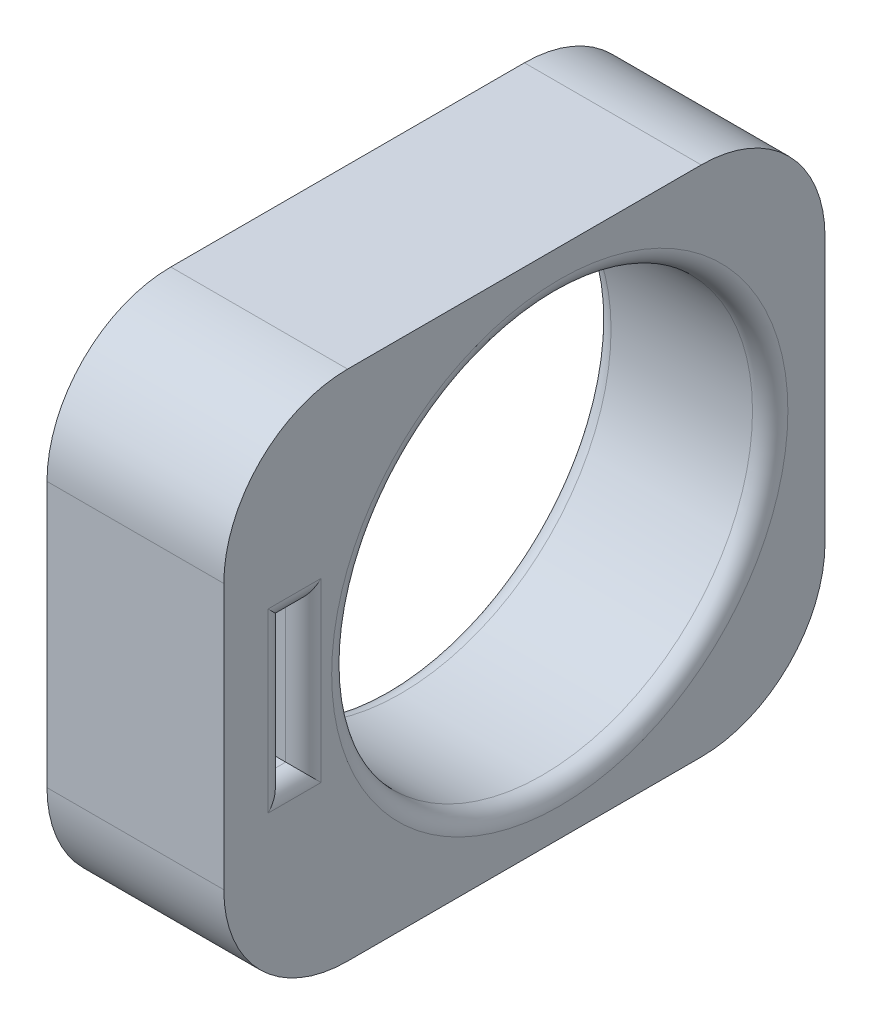
ISO-10303-21;
HEADER;
FILE_DESCRIPTION(('STEP AP214'),'2;1');
FILE_NAME('part.step','',(''),(''),'','','');
FILE_SCHEMA(('AUTOMOTIVE_DESIGN { 1 0 10303 214 1 1 1 1 }'));
ENDSEC;
DATA;
#1=APPLICATION_CONTEXT('core data for automotive mechanical design processes');
#2=APPLICATION_PROTOCOL_DEFINITION('international standard','automotive_design',2000,#1);
#3=PRODUCT_CONTEXT('',#1,'mechanical');
#4=PRODUCT('Part','Part','',(#3));
#5=PRODUCT_RELATED_PRODUCT_CATEGORY('part','',(#4));
#6=PRODUCT_DEFINITION_FORMATION('','',#4);
#7=PRODUCT_DEFINITION_CONTEXT('part definition',#1,'design');
#8=PRODUCT_DEFINITION('design','',#6,#7);
#9=PRODUCT_DEFINITION_SHAPE('','',#8);
#10=(LENGTH_UNIT() NAMED_UNIT(*) SI_UNIT(.MILLI.,.METRE.));
#11=(NAMED_UNIT(*) PLANE_ANGLE_UNIT() SI_UNIT($,.RADIAN.));
#12=(NAMED_UNIT(*) SI_UNIT($,.STERADIAN.) SOLID_ANGLE_UNIT());
#13=UNCERTAINTY_MEASURE_WITH_UNIT(LENGTH_MEASURE(1.E-05),#10,'distance_accuracy_value','');
#14=(GEOMETRIC_REPRESENTATION_CONTEXT(3) GLOBAL_UNCERTAINTY_ASSIGNED_CONTEXT((#13)) GLOBAL_UNIT_ASSIGNED_CONTEXT((#10,
#11,#12)) REPRESENTATION_CONTEXT('',''));
#15=CARTESIAN_POINT('',(0.,0.,0.));
#16=DIRECTION('',(0.,0.,1.));
#17=DIRECTION('',(1.,0.,0.));
#18=AXIS2_PLACEMENT_3D('',#15,#16,#17);
#19=CARTESIAN_POINT('',(0.,-2.,34.));
#20=DIRECTION('',(1.,0.,0.));
#21=DIRECTION('',(0.,0.,-1.));
#22=AXIS2_PLACEMENT_3D('',#19,#20,#21);
#23=PLANE('',#22);
#24=DIRECTION('',(0.,1.,0.));
#25=VECTOR('',#24,1.);
#26=CARTESIAN_POINT('',(0.,-2.,28.5));
#27=LINE('',#26,#25);
#28=CARTESIAN_POINT('',(0.,7.5,28.5));
#29=VERTEX_POINT('',#28);
#30=CARTESIAN_POINT('',(0.,17.5,28.5));
#31=VERTEX_POINT('',#30);
#32=EDGE_CURVE('E187',#29,#31,#27,.T.);
#33=ORIENTED_EDGE('',*,*,#32,.T.);
#34=DIRECTION('',(0.,0.,1.));
#35=VECTOR('',#34,1.);
#36=CARTESIAN_POINT('',(0.,17.5,34.));
#37=LINE('',#36,#35);
#38=CARTESIAN_POINT('',(0.,17.5,31.5));
#39=VERTEX_POINT('',#38);
#40=EDGE_CURVE('E193',#31,#39,#37,.T.);
#41=ORIENTED_EDGE('',*,*,#40,.T.);
#42=DIRECTION('',(0.,-1.,0.));
#43=VECTOR('',#42,1.);
#44=CARTESIAN_POINT('',(0.,-2.,31.5));
#45=LINE('',#44,#43);
#46=CARTESIAN_POINT('',(0.,7.5,31.5));
#47=VERTEX_POINT('',#46);
#48=EDGE_CURVE('E191',#39,#47,#45,.T.);
#49=ORIENTED_EDGE('',*,*,#48,.T.);
#50=DIRECTION('',(0.,0.,-1.));
#51=VECTOR('',#50,1.);
#52=CARTESIAN_POINT('',(0.,7.5,34.));
#53=LINE('',#52,#51);
#54=EDGE_CURVE('E189',#47,#29,#53,.T.);
#55=ORIENTED_EDGE('',*,*,#54,.T.);
#56=EDGE_LOOP('',(#33,#41,#49,#55));
#57=FACE_BOUND('',#56,.T.);
#58=CARTESIAN_POINT('',(0.,12.5,15.));
#59=DIRECTION('',(1.,0.,0.));
#60=DIRECTION('',(0.,0.,-1.));
#61=AXIS2_PLACEMENT_3D('',#58,#59,#60);
#62=CIRCLE('',#61,12.9);
#63=CARTESIAN_POINT('',(0.,12.5,2.1));
#64=VERTEX_POINT('',#63);
#65=EDGE_CURVE('E169',#64,#64,#62,.T.);
#66=ORIENTED_EDGE('',*,*,#65,.T.);
#67=EDGE_LOOP('',(#66));
#68=FACE_BOUND('',#67,.T.);
#69=DIRECTION('',(0.,0.,-1.));
#70=VECTOR('',#69,1.);
#71=CARTESIAN_POINT('',(0.,-2.,34.));
#72=LINE('',#71,#70);
#73=CARTESIAN_POINT('',(0.,-2.,27.));
#74=VERTEX_POINT('',#73);
#75=CARTESIAN_POINT('',(0.,-2.,7.));
#76=VERTEX_POINT('',#75);
#77=EDGE_CURVE('E258',#74,#76,#72,.T.);
#78=ORIENTED_EDGE('',*,*,#77,.F.);
#79=CARTESIAN_POINT('',(0.,5.,27.));
#80=DIRECTION('',(1.,0.,0.));
#81=DIRECTION('',(0.,0.,-1.));
#82=AXIS2_PLACEMENT_3D('',#79,#80,#81);
#83=CIRCLE('',#82,7.);
#84=CARTESIAN_POINT('',(0.,5.,34.));
#85=VERTEX_POINT('',#84);
#86=EDGE_CURVE('E43',#74,#85,#83,.F.);
#87=ORIENTED_EDGE('',*,*,#86,.T.);
#88=DIRECTION('',(0.,-1.,0.));
#89=VECTOR('',#88,1.);
#90=CARTESIAN_POINT('',(0.,-2.,34.));
#91=LINE('',#90,#89);
#92=CARTESIAN_POINT('',(0.,20.,34.));
#93=VERTEX_POINT('',#92);
#94=EDGE_CURVE('E257',#93,#85,#91,.T.);
#95=ORIENTED_EDGE('',*,*,#94,.F.);
#96=CARTESIAN_POINT('',(0.,20.,27.));
#97=DIRECTION('',(1.,0.,0.));
#98=DIRECTION('',(0.,0.,-1.));
#99=AXIS2_PLACEMENT_3D('',#96,#97,#98);
#100=CIRCLE('',#99,7.);
#101=CARTESIAN_POINT('',(0.,27.,27.));
#102=VERTEX_POINT('',#101);
#103=EDGE_CURVE('E50',#93,#102,#100,.F.);
#104=ORIENTED_EDGE('',*,*,#103,.T.);
#105=DIRECTION('',(0.,0.,-1.));
#106=VECTOR('',#105,1.);
#107=CARTESIAN_POINT('',(0.,27.,34.));
#108=LINE('',#107,#106);
#109=CARTESIAN_POINT('',(0.,27.,7.));
#110=VERTEX_POINT('',#109);
#111=EDGE_CURVE('E145',#102,#110,#108,.T.);
#112=ORIENTED_EDGE('',*,*,#111,.T.);
#113=CARTESIAN_POINT('',(0.,20.,7.));
#114=DIRECTION('',(1.,0.,0.));
#115=DIRECTION('',(0.,0.,-1.));
#116=AXIS2_PLACEMENT_3D('',#113,#114,#115);
#117=CIRCLE('',#116,7.);
#118=CARTESIAN_POINT('',(0.,20.,0.));
#119=VERTEX_POINT('',#118);
#120=EDGE_CURVE('E148',#110,#119,#117,.F.);
#121=ORIENTED_EDGE('',*,*,#120,.T.);
#122=DIRECTION('',(0.,-1.,0.));
#123=VECTOR('',#122,1.);
#124=CARTESIAN_POINT('',(0.,-2.,0.));
#125=LINE('',#124,#123);
#126=CARTESIAN_POINT('',(0.,5.,0.));
#127=VERTEX_POINT('',#126);
#128=EDGE_CURVE('E366',#119,#127,#125,.T.);
#129=ORIENTED_EDGE('',*,*,#128,.T.);
#130=CARTESIAN_POINT('',(0.,5.,7.));
#131=DIRECTION('',(1.,0.,0.));
#132=DIRECTION('',(0.,0.,-1.));
#133=AXIS2_PLACEMENT_3D('',#130,#131,#132);
#134=CIRCLE('',#133,7.);
#135=EDGE_CURVE('E164',#127,#76,#134,.F.);
#136=ORIENTED_EDGE('',*,*,#135,.T.);
#137=EDGE_LOOP('',(#78,#87,#95,#104,#112,#121,#129,#136));
#138=FACE_BOUND('',#137,.T.);
#139=ADVANCED_FACE('F35',(#57,#68,#138),#23,.F.);
#140=CARTESIAN_POINT('',(0.,-2.,34.));
#141=DIRECTION('',(0.,1.,0.));
#142=DIRECTION('',(0.,0.,1.));
#143=AXIS2_PLACEMENT_3D('',#140,#141,#142);
#144=PLANE('',#143);
#145=DIRECTION('',(0.,0.,-1.));
#146=VECTOR('',#145,1.);
#147=CARTESIAN_POINT('',(10.,-2.,34.));
#148=LINE('',#147,#146);
#149=CARTESIAN_POINT('',(10.,-2.,27.));
#150=VERTEX_POINT('',#149);
#151=CARTESIAN_POINT('',(10.,-2.,7.));
#152=VERTEX_POINT('',#151);
#153=EDGE_CURVE('E271',#150,#152,#148,.T.);
#154=ORIENTED_EDGE('',*,*,#153,.F.);
#155=DIRECTION('',(1.,0.,0.));
#156=VECTOR('',#155,1.);
#157=CARTESIAN_POINT('',(0.,-2.,27.));
#158=LINE('',#157,#156);
#159=EDGE_CURVE('E58',#150,#74,#158,.F.);
#160=ORIENTED_EDGE('',*,*,#159,.T.);
#161=ORIENTED_EDGE('',*,*,#77,.T.);
#162=DIRECTION('',(1.,0.,0.));
#163=VECTOR('',#162,1.);
#164=CARTESIAN_POINT('',(10.,-2.,7.));
#165=LINE('',#164,#163);
#166=EDGE_CURVE('E184',#76,#152,#165,.T.);
#167=ORIENTED_EDGE('',*,*,#166,.T.);
#168=EDGE_LOOP('',(#154,#160,#161,#167));
#169=FACE_BOUND('',#168,.T.);
#170=ADVANCED_FACE('F273',(#169),#144,.F.);
#171=CARTESIAN_POINT('',(10.,-2.,34.));
#172=DIRECTION('',(-1.,0.,0.));
#173=DIRECTION('',(0.,0.,1.));
#174=AXIS2_PLACEMENT_3D('',#171,#172,#173);
#175=PLANE('',#174);
#176=DIRECTION('',(0.,-1.,0.));
#177=VECTOR('',#176,1.);
#178=CARTESIAN_POINT('',(10.,-2.,28.5));
#179=LINE('',#178,#177);
#180=CARTESIAN_POINT('',(10.,17.5,28.5));
#181=VERTEX_POINT('',#180);
#182=CARTESIAN_POINT('',(10.,7.5,28.5));
#183=VERTEX_POINT('',#182);
#184=EDGE_CURVE('E205',#181,#183,#179,.T.);
#185=ORIENTED_EDGE('',*,*,#184,.T.);
#186=DIRECTION('',(0.,0.,1.));
#187=VECTOR('',#186,1.);
#188=CARTESIAN_POINT('',(10.,7.5,34.));
#189=LINE('',#188,#187);
#190=CARTESIAN_POINT('',(10.,7.5,31.5));
#191=VERTEX_POINT('',#190);
#192=EDGE_CURVE('E223',#183,#191,#189,.T.);
#193=ORIENTED_EDGE('',*,*,#192,.T.);
#194=DIRECTION('',(0.,1.,0.));
#195=VECTOR('',#194,1.);
#196=CARTESIAN_POINT('',(10.,-2.,31.5));
#197=LINE('',#196,#195);
#198=CARTESIAN_POINT('',(10.,17.5,31.5));
#199=VERTEX_POINT('',#198);
#200=EDGE_CURVE('E221',#191,#199,#197,.T.);
#201=ORIENTED_EDGE('',*,*,#200,.T.);
#202=DIRECTION('',(0.,0.,-1.));
#203=VECTOR('',#202,1.);
#204=CARTESIAN_POINT('',(10.,17.5,34.));
#205=LINE('',#204,#203);
#206=EDGE_CURVE('E219',#199,#181,#205,.T.);
#207=ORIENTED_EDGE('',*,*,#206,.T.);
#208=EDGE_LOOP('',(#185,#193,#201,#207));
#209=FACE_BOUND('',#208,.T.);
#210=CARTESIAN_POINT('',(10.,12.5,15.));
#211=DIRECTION('',(-1.,0.,0.));
#212=DIRECTION('',(0.,0.,1.));
#213=AXIS2_PLACEMENT_3D('',#210,#211,#212);
#214=CIRCLE('',#213,12.9);
#215=CARTESIAN_POINT('',(10.,12.5,27.9));
#216=VERTEX_POINT('',#215);
#217=EDGE_CURVE('E276',#216,#216,#214,.T.);
#218=ORIENTED_EDGE('',*,*,#217,.T.);
#219=EDGE_LOOP('',(#218));
#220=FACE_BOUND('',#219,.T.);
#221=DIRECTION('',(0.,1.,0.));
#222=VECTOR('',#221,1.);
#223=CARTESIAN_POINT('',(10.,-2.,34.));
#224=LINE('',#223,#222);
#225=CARTESIAN_POINT('',(10.,5.,34.));
#226=VERTEX_POINT('',#225);
#227=CARTESIAN_POINT('',(10.,20.,34.));
#228=VERTEX_POINT('',#227);
#229=EDGE_CURVE('E154',#226,#228,#224,.T.);
#230=ORIENTED_EDGE('',*,*,#229,.F.);
#231=CARTESIAN_POINT('',(10.,5.,27.));
#232=DIRECTION('',(-1.,0.,0.));
#233=DIRECTION('',(0.,0.,1.));
#234=AXIS2_PLACEMENT_3D('',#231,#232,#233);
#235=CIRCLE('',#234,7.);
#236=EDGE_CURVE('E252',#226,#150,#235,.F.);
#237=ORIENTED_EDGE('',*,*,#236,.T.);
#238=ORIENTED_EDGE('',*,*,#153,.T.);
#239=CARTESIAN_POINT('',(10.,5.,7.));
#240=DIRECTION('',(-1.,0.,0.));
#241=DIRECTION('',(0.,0.,1.));
#242=AXIS2_PLACEMENT_3D('',#239,#240,#241);
#243=CIRCLE('',#242,7.);
#244=CARTESIAN_POINT('',(10.,5.,0.));
#245=VERTEX_POINT('',#244);
#246=EDGE_CURVE('E180',#152,#245,#243,.F.);
#247=ORIENTED_EDGE('',*,*,#246,.T.);
#248=DIRECTION('',(0.,1.,0.));
#249=VECTOR('',#248,1.);
#250=CARTESIAN_POINT('',(10.,-2.,0.));
#251=LINE('',#250,#249);
#252=CARTESIAN_POINT('',(10.,20.,0.));
#253=VERTEX_POINT('',#252);
#254=EDGE_CURVE('E266',#245,#253,#251,.T.);
#255=ORIENTED_EDGE('',*,*,#254,.T.);
#256=CARTESIAN_POINT('',(10.,20.,7.));
#257=DIRECTION('',(-1.,0.,0.));
#258=DIRECTION('',(0.,0.,1.));
#259=AXIS2_PLACEMENT_3D('',#256,#257,#258);
#260=CIRCLE('',#259,7.);
#261=CARTESIAN_POINT('',(10.,27.,7.));
#262=VERTEX_POINT('',#261);
#263=EDGE_CURVE('E182',#253,#262,#260,.F.);
#264=ORIENTED_EDGE('',*,*,#263,.T.);
#265=DIRECTION('',(0.,0.,-1.));
#266=VECTOR('',#265,1.);
#267=CARTESIAN_POINT('',(10.,27.,34.));
#268=LINE('',#267,#266);
#269=CARTESIAN_POINT('',(10.,27.,27.));
#270=VERTEX_POINT('',#269);
#271=EDGE_CURVE('E153',#270,#262,#268,.T.);
#272=ORIENTED_EDGE('',*,*,#271,.F.);
#273=CARTESIAN_POINT('',(10.,20.,27.));
#274=DIRECTION('',(-1.,0.,0.));
#275=DIRECTION('',(0.,0.,1.));
#276=AXIS2_PLACEMENT_3D('',#273,#274,#275);
#277=CIRCLE('',#276,7.);
#278=EDGE_CURVE('E250',#270,#228,#277,.F.);
#279=ORIENTED_EDGE('',*,*,#278,.T.);
#280=EDGE_LOOP('',(#230,#237,#238,#247,#255,#264,#272,#279));
#281=FACE_BOUND('',#280,.T.);
#282=ADVANCED_FACE('F270',(#209,#220,#281),#175,.F.);
#283=CARTESIAN_POINT('',(0.,27.,34.));
#284=DIRECTION('',(0.,-1.,0.));
#285=DIRECTION('',(0.,0.,-1.));
#286=AXIS2_PLACEMENT_3D('',#283,#284,#285);
#287=PLANE('',#286);
#288=ORIENTED_EDGE('',*,*,#111,.F.);
#289=DIRECTION('',(-1.,0.,0.));
#290=VECTOR('',#289,1.);
#291=CARTESIAN_POINT('',(0.,27.,27.));
#292=LINE('',#291,#290);
#293=EDGE_CURVE('E12',#102,#270,#292,.F.);
#294=ORIENTED_EDGE('',*,*,#293,.T.);
#295=ORIENTED_EDGE('',*,*,#271,.T.);
#296=DIRECTION('',(-1.,0.,0.));
#297=VECTOR('',#296,1.);
#298=CARTESIAN_POINT('',(0.,27.,7.));
#299=LINE('',#298,#297);
#300=EDGE_CURVE('E161',#262,#110,#299,.T.);
#301=ORIENTED_EDGE('',*,*,#300,.T.);
#302=EDGE_LOOP('',(#288,#294,#295,#301));
#303=FACE_BOUND('',#302,.T.);
#304=ADVANCED_FACE('F166',(#303),#287,.F.);
#305=CARTESIAN_POINT('',(0.,0.,34.));
#306=DIRECTION('',(0.,0.,-1.));
#307=DIRECTION('',(-1.,0.,0.));
#308=AXIS2_PLACEMENT_3D('',#305,#306,#307);
#309=PLANE('',#308);
#310=ORIENTED_EDGE('',*,*,#94,.T.);
#311=DIRECTION('',(1.,0.,0.));
#312=VECTOR('',#311,1.);
#313=CARTESIAN_POINT('',(0.,5.,34.));
#314=LINE('',#313,#312);
#315=EDGE_CURVE('E247',#85,#226,#314,.T.);
#316=ORIENTED_EDGE('',*,*,#315,.T.);
#317=ORIENTED_EDGE('',*,*,#229,.T.);
#318=DIRECTION('',(-1.,0.,0.));
#319=VECTOR('',#318,1.);
#320=CARTESIAN_POINT('',(0.,20.,34.));
#321=LINE('',#320,#319);
#322=EDGE_CURVE('E235',#228,#93,#321,.T.);
#323=ORIENTED_EDGE('',*,*,#322,.T.);
#324=EDGE_LOOP('',(#310,#316,#317,#323));
#325=FACE_BOUND('',#324,.T.);
#326=ADVANCED_FACE('F262',(#325),#309,.F.);
#327=CARTESIAN_POINT('',(0.,0.,0.));
#328=DIRECTION('',(0.,0.,-1.));
#329=DIRECTION('',(-1.,0.,0.));
#330=AXIS2_PLACEMENT_3D('',#327,#328,#329);
#331=PLANE('',#330);
#332=ORIENTED_EDGE('',*,*,#128,.F.);
#333=DIRECTION('',(-1.,0.,0.));
#334=VECTOR('',#333,1.);
#335=CARTESIAN_POINT('',(10.,20.,0.));
#336=LINE('',#335,#334);
#337=EDGE_CURVE('E162',#119,#253,#336,.F.);
#338=ORIENTED_EDGE('',*,*,#337,.T.);
#339=ORIENTED_EDGE('',*,*,#254,.F.);
#340=DIRECTION('',(1.,0.,0.));
#341=VECTOR('',#340,1.);
#342=CARTESIAN_POINT('',(0.,5.,0.));
#343=LINE('',#342,#341);
#344=EDGE_CURVE('E163',#245,#127,#343,.F.);
#345=ORIENTED_EDGE('',*,*,#344,.T.);
#346=EDGE_LOOP('',(#332,#338,#339,#345));
#347=FACE_BOUND('',#346,.T.);
#348=ADVANCED_FACE('F373',(#347),#331,.T.);
#349=CARTESIAN_POINT('',(0.,12.5,15.));
#350=DIRECTION('',(1.,0.,0.));
#351=DIRECTION('',(0.,0.,-1.));
#352=AXIS2_PLACEMENT_3D('',#349,#350,#351);
#353=CYLINDRICAL_SURFACE('',#352,11.9);
#354=CARTESIAN_POINT('',(9.,12.5,15.));
#355=DIRECTION('',(-1.,0.,0.));
#356=DIRECTION('',(0.,0.,1.));
#357=AXIS2_PLACEMENT_3D('',#354,#355,#356);
#358=CIRCLE('',#357,11.9);
#359=CARTESIAN_POINT('',(9.,12.5,26.9));
#360=VERTEX_POINT('',#359);
#361=EDGE_CURVE('E174',#360,#360,#358,.F.);
#362=ORIENTED_EDGE('',*,*,#361,.T.);
#363=EDGE_LOOP('',(#362));
#364=FACE_BOUND('',#363,.T.);
#365=CARTESIAN_POINT('',(1.,12.5,15.));
#366=DIRECTION('',(1.,0.,0.));
#367=DIRECTION('',(0.,0.,-1.));
#368=AXIS2_PLACEMENT_3D('',#365,#366,#367);
#369=CIRCLE('',#368,11.9);
#370=CARTESIAN_POINT('',(1.,12.5,3.1));
#371=VERTEX_POINT('',#370);
#372=EDGE_CURVE('E282',#371,#371,#369,.F.);
#373=ORIENTED_EDGE('',*,*,#372,.T.);
#374=EDGE_LOOP('',(#373));
#375=FACE_BOUND('',#374,.T.);
#376=ADVANCED_FACE('F287',(#364,#375),#353,.F.);
#377=CARTESIAN_POINT('',(9.,12.5,15.));
#378=DIRECTION('',(-1.,0.,0.));
#379=DIRECTION('',(0.,0.,1.));
#380=AXIS2_PLACEMENT_3D('',#377,#378,#379);
#381=TOROIDAL_SURFACE('',#380,12.9,1.);
#382=ORIENTED_EDGE('',*,*,#361,.F.);
#383=EDGE_LOOP('',(#382));
#384=FACE_BOUND('',#383,.T.);
#385=ORIENTED_EDGE('',*,*,#217,.F.);
#386=EDGE_LOOP('',(#385));
#387=FACE_BOUND('',#386,.T.);
#388=ADVANCED_FACE('F290',(#384,#387),#381,.T.);
#389=CARTESIAN_POINT('',(1.,12.5,15.));
#390=DIRECTION('',(1.,0.,0.));
#391=DIRECTION('',(0.,0.,-1.));
#392=AXIS2_PLACEMENT_3D('',#389,#390,#391);
#393=TOROIDAL_SURFACE('',#392,12.9,1.);
#394=ORIENTED_EDGE('',*,*,#372,.F.);
#395=EDGE_LOOP('',(#394));
#396=FACE_BOUND('',#395,.T.);
#397=ORIENTED_EDGE('',*,*,#65,.F.);
#398=EDGE_LOOP('',(#397));
#399=FACE_BOUND('',#398,.T.);
#400=ADVANCED_FACE('F293',(#396,#399),#393,.T.);
#401=CARTESIAN_POINT('',(0.,20.,7.));
#402=DIRECTION('',(1.,0.,0.));
#403=DIRECTION('',(0.,0.,-1.));
#404=AXIS2_PLACEMENT_3D('',#401,#402,#403);
#405=CYLINDRICAL_SURFACE('',#404,7.);
#406=ORIENTED_EDGE('',*,*,#263,.F.);
#407=ORIENTED_EDGE('',*,*,#337,.F.);
#408=ORIENTED_EDGE('',*,*,#120,.F.);
#409=ORIENTED_EDGE('',*,*,#300,.F.);
#410=EDGE_LOOP('',(#406,#407,#408,#409));
#411=FACE_BOUND('',#410,.T.);
#412=ADVANCED_FACE('F160',(#411),#405,.T.);
#413=CARTESIAN_POINT('',(0.,5.,7.));
#414=DIRECTION('',(-1.,0.,0.));
#415=DIRECTION('',(0.,0.,1.));
#416=AXIS2_PLACEMENT_3D('',#413,#414,#415);
#417=CYLINDRICAL_SURFACE('',#416,7.);
#418=ORIENTED_EDGE('',*,*,#135,.F.);
#419=ORIENTED_EDGE('',*,*,#344,.F.);
#420=ORIENTED_EDGE('',*,*,#246,.F.);
#421=ORIENTED_EDGE('',*,*,#166,.F.);
#422=EDGE_LOOP('',(#418,#419,#420,#421));
#423=FACE_BOUND('',#422,.T.);
#424=ADVANCED_FACE('F318',(#423),#417,.T.);
#425=CARTESIAN_POINT('',(0.,8.5,29.5));
#426=DIRECTION('',(0.,-1.,0.));
#427=DIRECTION('',(0.,0.,-1.));
#428=AXIS2_PLACEMENT_3D('',#425,#426,#427);
#429=PLANE('',#428);
#430=DIRECTION('',(1.,0.,0.));
#431=VECTOR('',#430,1.);
#432=CARTESIAN_POINT('',(0.,8.5,30.5));
#433=LINE('',#432,#431);
#434=CARTESIAN_POINT('',(1.,8.5,30.5));
#435=VERTEX_POINT('',#434);
#436=CARTESIAN_POINT('',(9.,8.5,30.5));
#437=VERTEX_POINT('',#436);
#438=EDGE_CURVE('E401',#435,#437,#433,.T.);
#439=ORIENTED_EDGE('',*,*,#438,.T.);
#440=DIRECTION('',(0.,0.,1.));
#441=VECTOR('',#440,1.);
#442=CARTESIAN_POINT('',(9.,8.5,29.5));
#443=LINE('',#442,#441);
#444=CARTESIAN_POINT('',(9.,8.5,29.5));
#445=VERTEX_POINT('',#444);
#446=EDGE_CURVE('E226',#437,#445,#443,.F.);
#447=ORIENTED_EDGE('',*,*,#446,.T.);
#448=DIRECTION('',(1.,0.,0.));
#449=VECTOR('',#448,1.);
#450=CARTESIAN_POINT('',(0.,8.5,29.5));
#451=LINE('',#450,#449);
#452=CARTESIAN_POINT('',(1.,8.5,29.5));
#453=VERTEX_POINT('',#452);
#454=EDGE_CURVE('E368',#453,#445,#451,.T.);
#455=ORIENTED_EDGE('',*,*,#454,.F.);
#456=DIRECTION('',(0.,0.,-1.));
#457=VECTOR('',#456,1.);
#458=CARTESIAN_POINT('',(1.,8.5,29.5));
#459=LINE('',#458,#457);
#460=EDGE_CURVE('E201',#453,#435,#459,.F.);
#461=ORIENTED_EDGE('',*,*,#460,.T.);
#462=EDGE_LOOP('',(#439,#447,#455,#461));
#463=FACE_BOUND('',#462,.T.);
#464=ADVANCED_FACE('F321',(#463),#429,.F.);
#465=CARTESIAN_POINT('',(0.,8.5,30.5));
#466=DIRECTION('',(0.,0.,1.));
#467=DIRECTION('',(1.,0.,0.));
#468=AXIS2_PLACEMENT_3D('',#465,#466,#467);
#469=PLANE('',#468);
#470=DIRECTION('',(1.,0.,0.));
#471=VECTOR('',#470,1.);
#472=CARTESIAN_POINT('',(0.,16.5,30.5));
#473=LINE('',#472,#471);
#474=CARTESIAN_POINT('',(1.,16.5,30.5));
#475=VERTEX_POINT('',#474);
#476=CARTESIAN_POINT('',(9.,16.5,30.5));
#477=VERTEX_POINT('',#476);
#478=EDGE_CURVE('E407',#475,#477,#473,.T.);
#479=ORIENTED_EDGE('',*,*,#478,.T.);
#480=DIRECTION('',(0.,1.,0.));
#481=VECTOR('',#480,1.);
#482=CARTESIAN_POINT('',(9.,8.5,30.5));
#483=LINE('',#482,#481);
#484=EDGE_CURVE('E229',#477,#437,#483,.F.);
#485=ORIENTED_EDGE('',*,*,#484,.T.);
#486=ORIENTED_EDGE('',*,*,#438,.F.);
#487=DIRECTION('',(0.,-1.,0.));
#488=VECTOR('',#487,1.);
#489=CARTESIAN_POINT('',(1.,8.5,30.5));
#490=LINE('',#489,#488);
#491=EDGE_CURVE('E199',#435,#475,#490,.F.);
#492=ORIENTED_EDGE('',*,*,#491,.T.);
#493=EDGE_LOOP('',(#479,#485,#486,#492));
#494=FACE_BOUND('',#493,.T.);
#495=ADVANCED_FACE('F390',(#494),#469,.F.);
#496=CARTESIAN_POINT('',(0.,16.5,30.5));
#497=DIRECTION('',(0.,1.,0.));
#498=DIRECTION('',(0.,0.,1.));
#499=AXIS2_PLACEMENT_3D('',#496,#497,#498);
#500=PLANE('',#499);
#501=DIRECTION('',(1.,0.,0.));
#502=VECTOR('',#501,1.);
#503=CARTESIAN_POINT('',(0.,16.5,29.5));
#504=LINE('',#503,#502);
#505=CARTESIAN_POINT('',(1.,16.5,29.5));
#506=VERTEX_POINT('',#505);
#507=CARTESIAN_POINT('',(9.,16.5,29.5));
#508=VERTEX_POINT('',#507);
#509=EDGE_CURVE('E217',#506,#508,#504,.T.);
#510=ORIENTED_EDGE('',*,*,#509,.T.);
#511=DIRECTION('',(0.,0.,-1.));
#512=VECTOR('',#511,1.);
#513=CARTESIAN_POINT('',(9.,16.5,30.5));
#514=LINE('',#513,#512);
#515=EDGE_CURVE('E231',#508,#477,#514,.F.);
#516=ORIENTED_EDGE('',*,*,#515,.T.);
#517=ORIENTED_EDGE('',*,*,#478,.F.);
#518=DIRECTION('',(0.,0.,1.));
#519=VECTOR('',#518,1.);
#520=CARTESIAN_POINT('',(1.,16.5,30.5));
#521=LINE('',#520,#519);
#522=EDGE_CURVE('E196',#475,#506,#521,.F.);
#523=ORIENTED_EDGE('',*,*,#522,.T.);
#524=EDGE_LOOP('',(#510,#516,#517,#523));
#525=FACE_BOUND('',#524,.T.);
#526=ADVANCED_FACE('F386',(#525),#500,.F.);
#527=CARTESIAN_POINT('',(0.,12.5,29.5));
#528=DIRECTION('',(0.,0.,-1.));
#529=DIRECTION('',(-1.,0.,0.));
#530=AXIS2_PLACEMENT_3D('',#527,#528,#529);
#531=PLANE('',#530);
#532=ORIENTED_EDGE('',*,*,#454,.T.);
#533=DIRECTION('',(0.,-1.,0.));
#534=VECTOR('',#533,1.);
#535=CARTESIAN_POINT('',(9.,12.5,29.5));
#536=LINE('',#535,#534);
#537=EDGE_CURVE('E233',#445,#508,#536,.F.);
#538=ORIENTED_EDGE('',*,*,#537,.T.);
#539=ORIENTED_EDGE('',*,*,#509,.F.);
#540=DIRECTION('',(0.,1.,0.));
#541=VECTOR('',#540,1.);
#542=CARTESIAN_POINT('',(1.,12.5,29.5));
#543=LINE('',#542,#541);
#544=EDGE_CURVE('E203',#506,#453,#543,.F.);
#545=ORIENTED_EDGE('',*,*,#544,.T.);
#546=EDGE_LOOP('',(#532,#538,#539,#545));
#547=FACE_BOUND('',#546,.T.);
#548=ADVANCED_FACE('F339',(#547),#531,.F.);
#549=CARTESIAN_POINT('',(1.,7.5,34.));
#550=DIRECTION('',(0.,0.,-1.));
#551=DIRECTION('',(-1.,0.,0.));
#552=AXIS2_PLACEMENT_3D('',#549,#550,#551);
#553=CYLINDRICAL_SURFACE('',#552,1.);
#554=CARTESIAN_POINT('',(1.,7.5,31.5));
#555=DIRECTION('',(0.,-0.707106781186547,-0.707106781186547));
#556=DIRECTION('',(0.,-0.707106781186547,0.707106781186547));
#557=AXIS2_PLACEMENT_3D('',#554,#555,#556);
#558=ELLIPSE('',#557,1.41421356237309,1.);
#559=EDGE_CURVE('E211',#435,#47,#558,.F.);
#560=ORIENTED_EDGE('',*,*,#559,.F.);
#561=ORIENTED_EDGE('',*,*,#460,.F.);
#562=CARTESIAN_POINT('',(1.,7.5,28.5));
#563=DIRECTION('',(0.,0.707106781186547,-0.707106781186547));
#564=DIRECTION('',(0.,-0.707106781186547,-0.707106781186547));
#565=AXIS2_PLACEMENT_3D('',#562,#563,#564);
#566=ELLIPSE('',#565,1.41421356237309,1.);
#567=EDGE_CURVE('E214',#29,#453,#566,.T.);
#568=ORIENTED_EDGE('',*,*,#567,.F.);
#569=ORIENTED_EDGE('',*,*,#54,.F.);
#570=EDGE_LOOP('',(#560,#561,#568,#569));
#571=FACE_BOUND('',#570,.T.);
#572=ADVANCED_FACE('F335',(#571),#553,.T.);
#573=CARTESIAN_POINT('',(1.,-2.,28.5));
#574=DIRECTION('',(0.,1.,0.));
#575=DIRECTION('',(0.,0.,1.));
#576=AXIS2_PLACEMENT_3D('',#573,#574,#575);
#577=CYLINDRICAL_SURFACE('',#576,1.);
#578=ORIENTED_EDGE('',*,*,#567,.T.);
#579=ORIENTED_EDGE('',*,*,#544,.F.);
#580=CARTESIAN_POINT('',(1.,17.5,28.5));
#581=DIRECTION('',(0.,0.707106781186547,0.707106781186547));
#582=DIRECTION('',(0.,-0.707106781186547,0.707106781186547));
#583=AXIS2_PLACEMENT_3D('',#580,#581,#582);
#584=ELLIPSE('',#583,1.41421356237309,1.);
#585=EDGE_CURVE('E208',#31,#506,#584,.T.);
#586=ORIENTED_EDGE('',*,*,#585,.F.);
#587=ORIENTED_EDGE('',*,*,#32,.F.);
#588=EDGE_LOOP('',(#578,#579,#586,#587));
#589=FACE_BOUND('',#588,.T.);
#590=ADVANCED_FACE('F331',(#589),#577,.T.);
#591=CARTESIAN_POINT('',(1.,-2.,31.5));
#592=DIRECTION('',(0.,-1.,0.));
#593=DIRECTION('',(0.,0.,-1.));
#594=AXIS2_PLACEMENT_3D('',#591,#592,#593);
#595=CYLINDRICAL_SURFACE('',#594,1.);
#596=ORIENTED_EDGE('',*,*,#559,.T.);
#597=ORIENTED_EDGE('',*,*,#48,.F.);
#598=CARTESIAN_POINT('',(1.,17.5,31.5));
#599=DIRECTION('',(0.,-0.707106781186547,0.707106781186547));
#600=DIRECTION('',(0.,0.707106781186547,0.707106781186547));
#601=AXIS2_PLACEMENT_3D('',#598,#599,#600);
#602=ELLIPSE('',#601,1.41421356237309,1.);
#603=EDGE_CURVE('E206',#475,#39,#602,.F.);
#604=ORIENTED_EDGE('',*,*,#603,.F.);
#605=ORIENTED_EDGE('',*,*,#491,.F.);
#606=EDGE_LOOP('',(#596,#597,#604,#605));
#607=FACE_BOUND('',#606,.T.);
#608=ADVANCED_FACE('F327',(#607),#595,.T.);
#609=CARTESIAN_POINT('',(1.,17.5,34.));
#610=DIRECTION('',(0.,0.,1.));
#611=DIRECTION('',(1.,0.,0.));
#612=AXIS2_PLACEMENT_3D('',#609,#610,#611);
#613=CYLINDRICAL_SURFACE('',#612,1.);
#614=ORIENTED_EDGE('',*,*,#585,.T.);
#615=ORIENTED_EDGE('',*,*,#522,.F.);
#616=ORIENTED_EDGE('',*,*,#603,.T.);
#617=ORIENTED_EDGE('',*,*,#40,.F.);
#618=EDGE_LOOP('',(#614,#615,#616,#617));
#619=FACE_BOUND('',#618,.T.);
#620=ADVANCED_FACE('F323',(#619),#613,.T.);
#621=CARTESIAN_POINT('',(9.,17.5,34.));
#622=DIRECTION('',(0.,0.,-1.));
#623=DIRECTION('',(-1.,0.,0.));
#624=AXIS2_PLACEMENT_3D('',#621,#622,#623);
#625=CYLINDRICAL_SURFACE('',#624,1.);
#626=CARTESIAN_POINT('',(9.,17.5,31.5));
#627=DIRECTION('',(0.,0.707106781186547,-0.707106781186547));
#628=DIRECTION('',(0.,0.707106781186547,0.707106781186547));
#629=AXIS2_PLACEMENT_3D('',#626,#627,#628);
#630=ELLIPSE('',#629,1.41421356237309,1.);
#631=EDGE_CURVE('E240',#477,#199,#630,.F.);
#632=ORIENTED_EDGE('',*,*,#631,.F.);
#633=ORIENTED_EDGE('',*,*,#515,.F.);
#634=CARTESIAN_POINT('',(9.,17.5,28.5));
#635=DIRECTION('',(0.,-0.707106781186547,-0.707106781186547));
#636=DIRECTION('',(0.,0.707106781186547,-0.707106781186547));
#637=AXIS2_PLACEMENT_3D('',#634,#635,#636);
#638=ELLIPSE('',#637,1.41421356237309,1.);
#639=EDGE_CURVE('E209',#181,#508,#638,.T.);
#640=ORIENTED_EDGE('',*,*,#639,.F.);
#641=ORIENTED_EDGE('',*,*,#206,.F.);
#642=EDGE_LOOP('',(#632,#633,#640,#641));
#643=FACE_BOUND('',#642,.T.);
#644=ADVANCED_FACE('F326',(#643),#625,.T.);
#645=CARTESIAN_POINT('',(9.,-2.,28.5));
#646=DIRECTION('',(0.,-1.,0.));
#647=DIRECTION('',(0.,0.,-1.));
#648=AXIS2_PLACEMENT_3D('',#645,#646,#647);
#649=CYLINDRICAL_SURFACE('',#648,1.);
#650=ORIENTED_EDGE('',*,*,#639,.T.);
#651=ORIENTED_EDGE('',*,*,#537,.F.);
#652=CARTESIAN_POINT('',(9.,7.5,28.5));
#653=DIRECTION('',(0.,-0.707106781186547,0.707106781186547));
#654=DIRECTION('',(0.,0.707106781186547,0.707106781186547));
#655=AXIS2_PLACEMENT_3D('',#652,#653,#654);
#656=ELLIPSE('',#655,1.41421356237309,1.);
#657=EDGE_CURVE('E238',#183,#445,#656,.T.);
#658=ORIENTED_EDGE('',*,*,#657,.F.);
#659=ORIENTED_EDGE('',*,*,#184,.F.);
#660=EDGE_LOOP('',(#650,#651,#658,#659));
#661=FACE_BOUND('',#660,.T.);
#662=ADVANCED_FACE('F348',(#661),#649,.T.);
#663=CARTESIAN_POINT('',(9.,-2.,31.5));
#664=DIRECTION('',(0.,1.,0.));
#665=DIRECTION('',(0.,0.,1.));
#666=AXIS2_PLACEMENT_3D('',#663,#664,#665);
#667=CYLINDRICAL_SURFACE('',#666,1.);
#668=ORIENTED_EDGE('',*,*,#631,.T.);
#669=ORIENTED_EDGE('',*,*,#200,.F.);
#670=CARTESIAN_POINT('',(9.,7.5,31.5));
#671=DIRECTION('',(0.,0.707106781186547,0.707106781186547));
#672=DIRECTION('',(0.,-0.707106781186547,0.707106781186547));
#673=AXIS2_PLACEMENT_3D('',#670,#671,#672);
#674=ELLIPSE('',#673,1.41421356237309,1.);
#675=EDGE_CURVE('E236',#437,#191,#674,.F.);
#676=ORIENTED_EDGE('',*,*,#675,.F.);
#677=ORIENTED_EDGE('',*,*,#484,.F.);
#678=EDGE_LOOP('',(#668,#669,#676,#677));
#679=FACE_BOUND('',#678,.T.);
#680=ADVANCED_FACE('F344',(#679),#667,.T.);
#681=CARTESIAN_POINT('',(9.,7.5,34.));
#682=DIRECTION('',(0.,0.,1.));
#683=DIRECTION('',(1.,0.,0.));
#684=AXIS2_PLACEMENT_3D('',#681,#682,#683);
#685=CYLINDRICAL_SURFACE('',#684,1.);
#686=ORIENTED_EDGE('',*,*,#657,.T.);
#687=ORIENTED_EDGE('',*,*,#446,.F.);
#688=ORIENTED_EDGE('',*,*,#675,.T.);
#689=ORIENTED_EDGE('',*,*,#192,.F.);
#690=EDGE_LOOP('',(#686,#687,#688,#689));
#691=FACE_BOUND('',#690,.T.);
#692=ADVANCED_FACE('F341',(#691),#685,.T.);
#693=CARTESIAN_POINT('',(0.,5.,27.));
#694=DIRECTION('',(1.,0.,0.));
#695=DIRECTION('',(0.,0.,-1.));
#696=AXIS2_PLACEMENT_3D('',#693,#694,#695);
#697=CYLINDRICAL_SURFACE('',#696,7.);
#698=ORIENTED_EDGE('',*,*,#86,.F.);
#699=ORIENTED_EDGE('',*,*,#159,.F.);
#700=ORIENTED_EDGE('',*,*,#236,.F.);
#701=ORIENTED_EDGE('',*,*,#315,.F.);
#702=EDGE_LOOP('',(#698,#699,#700,#701));
#703=FACE_BOUND('',#702,.T.);
#704=ADVANCED_FACE('F268',(#703),#697,.T.);
#705=CARTESIAN_POINT('',(0.,20.,27.));
#706=DIRECTION('',(-1.,0.,0.));
#707=DIRECTION('',(0.,0.,1.));
#708=AXIS2_PLACEMENT_3D('',#705,#706,#707);
#709=CYLINDRICAL_SURFACE('',#708,7.);
#710=ORIENTED_EDGE('',*,*,#278,.F.);
#711=ORIENTED_EDGE('',*,*,#293,.F.);
#712=ORIENTED_EDGE('',*,*,#103,.F.);
#713=ORIENTED_EDGE('',*,*,#322,.F.);
#714=EDGE_LOOP('',(#710,#711,#712,#713));
#715=FACE_BOUND('',#714,.T.);
#716=ADVANCED_FACE('F37',(#715),#709,.T.);
#717=CLOSED_SHELL('',(#139,#170,#282,#304,#326,#348,#376,#388,#400,#412,#424,#464,#495,#526,
#548,#572,#590,#608,#620,#644,#662,#680,#692,#704,#716));
#718=MANIFOLD_SOLID_BREP('B2',#717);
#719=ADVANCED_BREP_SHAPE_REPRESENTATION('',(#18,#718),#14);
#720=SHAPE_DEFINITION_REPRESENTATION(#9,#719);
ENDSEC;
END-ISO-10303-21;
